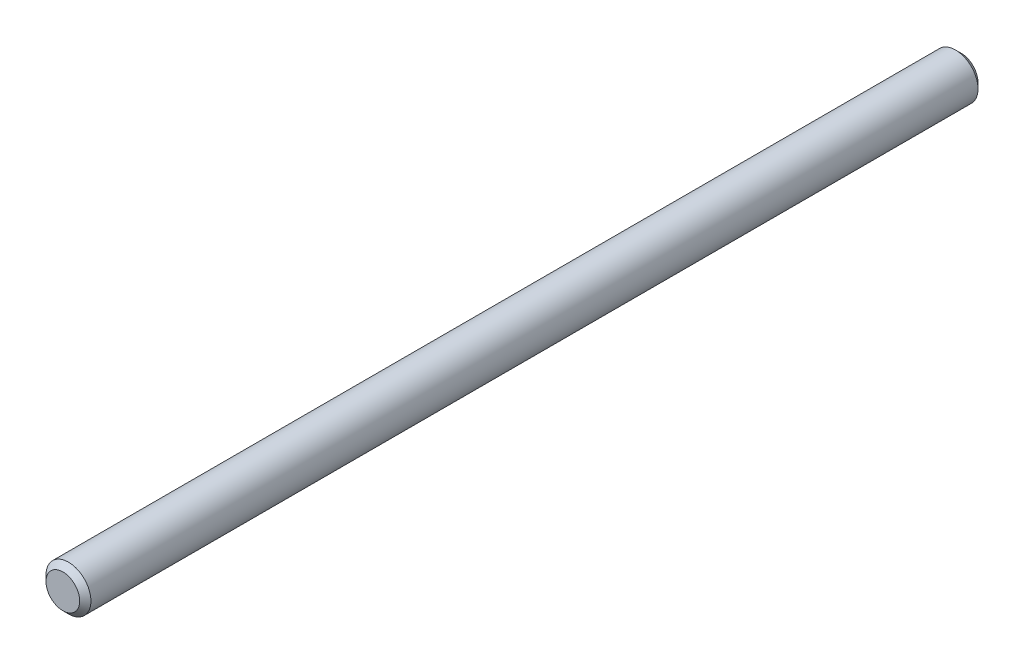
ISO-10303-21;
HEADER;
FILE_DESCRIPTION(('STEP AP214'),'2;1');
FILE_NAME('part.step','',(''),(''),'','','');
FILE_SCHEMA(('AUTOMOTIVE_DESIGN { 1 0 10303 214 1 1 1 1 }'));
ENDSEC;
DATA;
#1=APPLICATION_CONTEXT('core data for automotive mechanical design processes');
#2=APPLICATION_PROTOCOL_DEFINITION('international standard','automotive_design',2000,#1);
#3=PRODUCT_CONTEXT('',#1,'mechanical');
#4=PRODUCT('Part','Part','',(#3));
#5=PRODUCT_RELATED_PRODUCT_CATEGORY('part','',(#4));
#6=PRODUCT_DEFINITION_FORMATION('','',#4);
#7=PRODUCT_DEFINITION_CONTEXT('part definition',#1,'design');
#8=PRODUCT_DEFINITION('design','',#6,#7);
#9=PRODUCT_DEFINITION_SHAPE('','',#8);
#10=(LENGTH_UNIT() NAMED_UNIT(*) SI_UNIT(.MILLI.,.METRE.));
#11=(NAMED_UNIT(*) PLANE_ANGLE_UNIT() SI_UNIT($,.RADIAN.));
#12=(NAMED_UNIT(*) SI_UNIT($,.STERADIAN.) SOLID_ANGLE_UNIT());
#13=UNCERTAINTY_MEASURE_WITH_UNIT(LENGTH_MEASURE(1.E-05),#10,'distance_accuracy_value','');
#14=(GEOMETRIC_REPRESENTATION_CONTEXT(3) GLOBAL_UNCERTAINTY_ASSIGNED_CONTEXT((#13)) GLOBAL_UNIT_ASSIGNED_CONTEXT((#10,
#11,#12)) REPRESENTATION_CONTEXT('',''));
#15=CARTESIAN_POINT('',(0.,0.,0.));
#16=DIRECTION('',(0.,0.,1.));
#17=DIRECTION('',(1.,0.,0.));
#18=AXIS2_PLACEMENT_3D('',#15,#16,#17);
#19=CARTESIAN_POINT('',(0.,0.,-80.));
#20=DIRECTION('',(0.,0.,1.));
#21=DIRECTION('',(1.,0.,0.));
#22=AXIS2_PLACEMENT_3D('',#19,#20,#21);
#23=CYLINDRICAL_SURFACE('',#22,2.);
#24=CARTESIAN_POINT('',(0.,0.,-79.5));
#25=DIRECTION('',(0.,0.,1.));
#26=DIRECTION('',(1.,0.,0.));
#27=AXIS2_PLACEMENT_3D('',#24,#25,#26);
#28=CIRCLE('',#27,2.);
#29=CARTESIAN_POINT('',(2.,0.,-79.5));
#30=VERTEX_POINT('',#29);
#31=EDGE_CURVE('E48',#30,#30,#28,.T.);
#32=ORIENTED_EDGE('',*,*,#31,.T.);
#33=EDGE_LOOP('',(#32));
#34=FACE_BOUND('',#33,.T.);
#35=CARTESIAN_POINT('',(0.,0.,-0.5));
#36=DIRECTION('',(0.,0.,1.));
#37=DIRECTION('',(1.,0.,0.));
#38=AXIS2_PLACEMENT_3D('',#35,#36,#37);
#39=CIRCLE('',#38,2.);
#40=CARTESIAN_POINT('',(2.,0.,-0.5));
#41=VERTEX_POINT('',#40);
#42=EDGE_CURVE('E52',#41,#41,#39,.F.);
#43=ORIENTED_EDGE('',*,*,#42,.T.);
#44=EDGE_LOOP('',(#43));
#45=FACE_BOUND('',#44,.T.);
#46=ADVANCED_FACE('F37',(#34,#45),#23,.T.);
#47=CARTESIAN_POINT('',(0.,0.,-80.));
#48=DIRECTION('',(0.,0.,1.));
#49=DIRECTION('',(1.,0.,0.));
#50=AXIS2_PLACEMENT_3D('',#47,#48,#49);
#51=PLANE('',#50);
#52=CARTESIAN_POINT('',(0.,0.,-80.));
#53=DIRECTION('',(0.,0.,1.));
#54=DIRECTION('',(1.,0.,0.));
#55=AXIS2_PLACEMENT_3D('',#52,#53,#54);
#56=CIRCLE('',#55,1.49999999999998);
#57=CARTESIAN_POINT('',(1.49999999999998,0.,-80.));
#58=VERTEX_POINT('',#57);
#59=EDGE_CURVE('E44',#58,#58,#56,.F.);
#60=ORIENTED_EDGE('',*,*,#59,.T.);
#61=EDGE_LOOP('',(#60));
#62=FACE_BOUND('',#61,.T.);
#63=ADVANCED_FACE('F68',(#62),#51,.F.);
#64=CARTESIAN_POINT('',(0.,0.,0.));
#65=DIRECTION('',(0.,0.,1.));
#66=DIRECTION('',(1.,0.,0.));
#67=AXIS2_PLACEMENT_3D('',#64,#65,#66);
#68=PLANE('',#67);
#69=CARTESIAN_POINT('',(0.,0.,0.));
#70=DIRECTION('',(0.,0.,1.));
#71=DIRECTION('',(1.,0.,0.));
#72=AXIS2_PLACEMENT_3D('',#69,#70,#71);
#73=CIRCLE('',#72,1.5);
#74=CARTESIAN_POINT('',(1.5,0.,0.));
#75=VERTEX_POINT('',#74);
#76=EDGE_CURVE('E10',#75,#75,#73,.T.);
#77=ORIENTED_EDGE('',*,*,#76,.T.);
#78=EDGE_LOOP('',(#77));
#79=FACE_BOUND('',#78,.T.);
#80=ADVANCED_FACE('F65',(#79),#68,.T.);
#81=CARTESIAN_POINT('',(0.,0.,-79.5));
#82=DIRECTION('',(0.,0.,1.));
#83=DIRECTION('',(1.,0.,0.));
#84=AXIS2_PLACEMENT_3D('',#81,#82,#83);
#85=CONICAL_SURFACE('',#84,2.,0.785398163397453);
#86=ORIENTED_EDGE('',*,*,#59,.F.);
#87=EDGE_LOOP('',(#86));
#88=FACE_BOUND('',#87,.T.);
#89=ORIENTED_EDGE('',*,*,#31,.F.);
#90=EDGE_LOOP('',(#89));
#91=FACE_BOUND('',#90,.T.);
#92=ADVANCED_FACE('F61',(#88,#91),#85,.T.);
#93=CARTESIAN_POINT('',(0.,0.,0.));
#94=DIRECTION('',(0.,0.,-1.));
#95=DIRECTION('',(-1.,0.,0.));
#96=AXIS2_PLACEMENT_3D('',#93,#94,#95);
#97=CONICAL_SURFACE('',#96,1.5,0.785398163397447);
#98=ORIENTED_EDGE('',*,*,#42,.F.);
#99=EDGE_LOOP('',(#98));
#100=FACE_BOUND('',#99,.T.);
#101=ORIENTED_EDGE('',*,*,#76,.F.);
#102=EDGE_LOOP('',(#101));
#103=FACE_BOUND('',#102,.T.);
#104=ADVANCED_FACE('F39',(#100,#103),#97,.T.);
#105=CLOSED_SHELL('',(#46,#63,#80,#92,#104));
#106=MANIFOLD_SOLID_BREP('B2',#105);
#107=ADVANCED_BREP_SHAPE_REPRESENTATION('',(#18,#106),#14);
#108=SHAPE_DEFINITION_REPRESENTATION(#9,#107);
ENDSEC;
END-ISO-10303-21;
